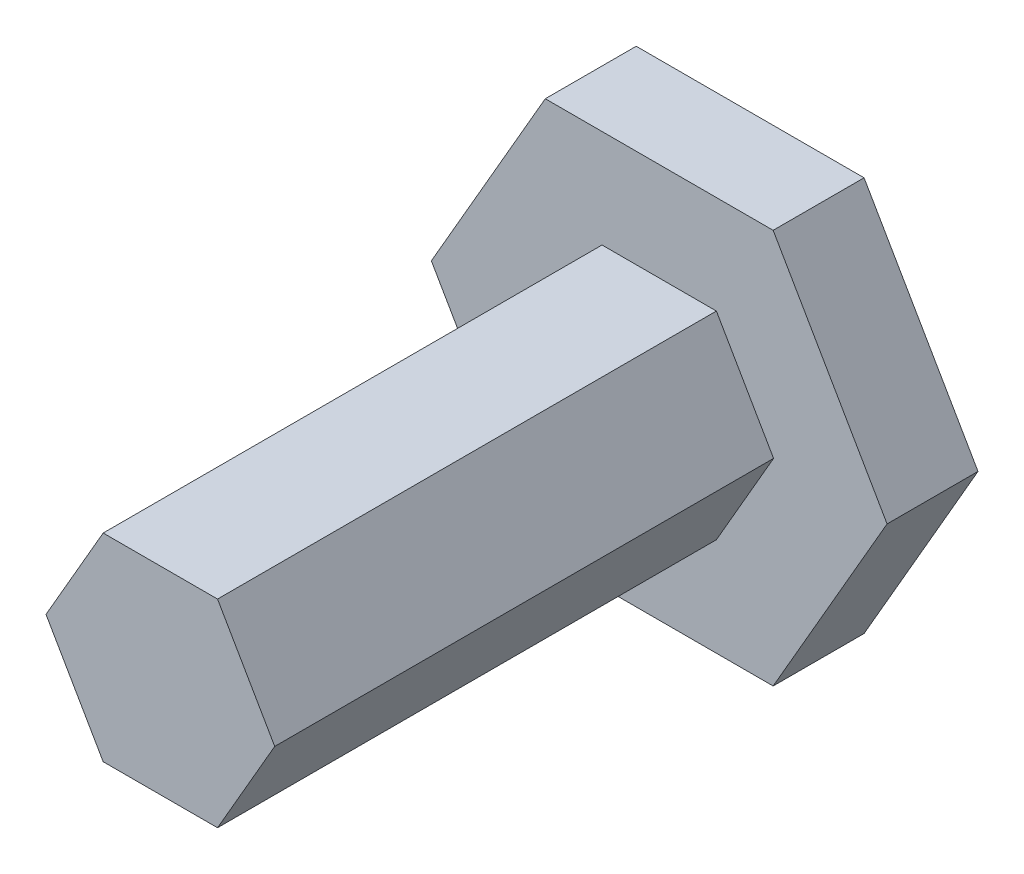
ISO-10303-21;
HEADER;
FILE_DESCRIPTION(('STEP AP214'),'2;1');
FILE_NAME('part.step','',(''),(''),'','','');
FILE_SCHEMA(('AUTOMOTIVE_DESIGN { 1 0 10303 214 1 1 1 1 }'));
ENDSEC;
DATA;
#1=APPLICATION_CONTEXT('core data for automotive mechanical design processes');
#2=APPLICATION_PROTOCOL_DEFINITION('international standard','automotive_design',2000,#1);
#3=PRODUCT_CONTEXT('',#1,'mechanical');
#4=PRODUCT('Part','Part','',(#3));
#5=PRODUCT_RELATED_PRODUCT_CATEGORY('part','',(#4));
#6=PRODUCT_DEFINITION_FORMATION('','',#4);
#7=PRODUCT_DEFINITION_CONTEXT('part definition',#1,'design');
#8=PRODUCT_DEFINITION('design','',#6,#7);
#9=PRODUCT_DEFINITION_SHAPE('','',#8);
#10=(LENGTH_UNIT() NAMED_UNIT(*) SI_UNIT(.MILLI.,.METRE.));
#11=(NAMED_UNIT(*) PLANE_ANGLE_UNIT() SI_UNIT($,.RADIAN.));
#12=(NAMED_UNIT(*) SI_UNIT($,.STERADIAN.) SOLID_ANGLE_UNIT());
#13=UNCERTAINTY_MEASURE_WITH_UNIT(LENGTH_MEASURE(1.E-05),#10,'distance_accuracy_value','');
#14=(GEOMETRIC_REPRESENTATION_CONTEXT(3) GLOBAL_UNCERTAINTY_ASSIGNED_CONTEXT((#13)) GLOBAL_UNIT_ASSIGNED_CONTEXT((#10,
#11,#12)) REPRESENTATION_CONTEXT('',''));
#15=CARTESIAN_POINT('',(0.,0.,0.));
#16=DIRECTION('',(0.,0.,1.));
#17=DIRECTION('',(1.,0.,0.));
#18=AXIS2_PLACEMENT_3D('',#15,#16,#17);
#19=CARTESIAN_POINT('',(-1.74509618943233,-1.00753175473055,10.));
#20=DIRECTION('',(0.866025403784439,0.5,0.));
#21=DIRECTION('',(-0.5,0.866025403784439,0.));
#22=AXIS2_PLACEMENT_3D('',#19,#20,#21);
#23=PLANE('',#22);
#24=DIRECTION('',(0.5,-0.866025403784439,0.));
#25=VECTOR('',#24,1.);
#26=CARTESIAN_POINT('',(-1.74509618943233,-1.00753175473055,-0.150000000000001));
#27=LINE('',#26,#25);
#28=CARTESIAN_POINT('',(-2.32679491924311,0.,-0.15));
#29=VERTEX_POINT('',#28);
#30=CARTESIAN_POINT('',(-1.16339745962156,-2.0150635094611,-0.15));
#31=VERTEX_POINT('',#30);
#32=EDGE_CURVE('E136',#29,#31,#27,.T.);
#33=ORIENTED_EDGE('',*,*,#32,.T.);
#34=DIRECTION('',(0.,0.,-1.));
#35=VECTOR('',#34,1.);
#36=CARTESIAN_POINT('',(-1.16339745962156,-2.0150635094611,10.));
#37=LINE('',#36,#35);
#38=CARTESIAN_POINT('',(-1.16339745962156,-2.0150635094611,10.));
#39=VERTEX_POINT('',#38);
#40=EDGE_CURVE('E12',#39,#31,#37,.T.);
#41=ORIENTED_EDGE('',*,*,#40,.F.);
#42=DIRECTION('',(0.5,-0.866025403784439,0.));
#43=VECTOR('',#42,1.);
#44=CARTESIAN_POINT('',(-1.74509618943233,-1.00753175473055,10.));
#45=LINE('',#44,#43);
#46=CARTESIAN_POINT('',(-2.32679491924311,0.,10.));
#47=VERTEX_POINT('',#46);
#48=EDGE_CURVE('E155',#47,#39,#45,.T.);
#49=ORIENTED_EDGE('',*,*,#48,.F.);
#50=DIRECTION('',(0.,0.,-1.));
#51=VECTOR('',#50,1.);
#52=CARTESIAN_POINT('',(-2.32679491924311,0.,10.));
#53=LINE('',#52,#51);
#54=EDGE_CURVE('E151',#47,#29,#53,.T.);
#55=ORIENTED_EDGE('',*,*,#54,.T.);
#56=EDGE_LOOP('',(#33,#41,#49,#55));
#57=FACE_BOUND('',#56,.T.);
#58=ADVANCED_FACE('F42',(#57),#23,.F.);
#59=CARTESIAN_POINT('',(0.,-2.0150635094611,10.));
#60=DIRECTION('',(0.,1.,0.));
#61=DIRECTION('',(-1.,0.,0.));
#62=AXIS2_PLACEMENT_3D('',#59,#60,#61);
#63=PLANE('',#62);
#64=DIRECTION('',(1.,0.,0.));
#65=VECTOR('',#64,1.);
#66=CARTESIAN_POINT('',(0.,-2.0150635094611,-0.150000000000001));
#67=LINE('',#66,#65);
#68=CARTESIAN_POINT('',(1.16339745962155,-2.0150635094611,-0.15));
#69=VERTEX_POINT('',#68);
#70=EDGE_CURVE('E142',#31,#69,#67,.T.);
#71=ORIENTED_EDGE('',*,*,#70,.T.);
#72=DIRECTION('',(0.,0.,-1.));
#73=VECTOR('',#72,1.);
#74=CARTESIAN_POINT('',(1.16339745962155,-2.0150635094611,10.));
#75=LINE('',#74,#73);
#76=CARTESIAN_POINT('',(1.16339745962155,-2.0150635094611,10.));
#77=VERTEX_POINT('',#76);
#78=EDGE_CURVE('E52',#77,#69,#75,.T.);
#79=ORIENTED_EDGE('',*,*,#78,.F.);
#80=DIRECTION('',(1.,0.,0.));
#81=VECTOR('',#80,1.);
#82=CARTESIAN_POINT('',(0.,-2.0150635094611,10.));
#83=LINE('',#82,#81);
#84=EDGE_CURVE('E73',#39,#77,#83,.T.);
#85=ORIENTED_EDGE('',*,*,#84,.F.);
#86=ORIENTED_EDGE('',*,*,#40,.T.);
#87=EDGE_LOOP('',(#71,#79,#85,#86));
#88=FACE_BOUND('',#87,.T.);
#89=ADVANCED_FACE('F192',(#88),#63,.F.);
#90=CARTESIAN_POINT('',(1.74509618943233,-1.00753175473055,10.));
#91=DIRECTION('',(-0.866025403784439,0.5,0.));
#92=DIRECTION('',(-0.5,-0.866025403784439,0.));
#93=AXIS2_PLACEMENT_3D('',#90,#91,#92);
#94=PLANE('',#93);
#95=DIRECTION('',(0.5,0.866025403784439,0.));
#96=VECTOR('',#95,1.);
#97=CARTESIAN_POINT('',(1.74509618943233,-1.00753175473055,-0.150000000000001));
#98=LINE('',#97,#96);
#99=CARTESIAN_POINT('',(2.32679491924311,0.,-0.15));
#100=VERTEX_POINT('',#99);
#101=EDGE_CURVE('E196',#69,#100,#98,.T.);
#102=ORIENTED_EDGE('',*,*,#101,.T.);
#103=DIRECTION('',(0.,0.,-1.));
#104=VECTOR('',#103,1.);
#105=CARTESIAN_POINT('',(2.32679491924311,0.,10.));
#106=LINE('',#105,#104);
#107=CARTESIAN_POINT('',(2.32679491924311,0.,10.));
#108=VERTEX_POINT('',#107);
#109=EDGE_CURVE('E167',#108,#100,#106,.T.);
#110=ORIENTED_EDGE('',*,*,#109,.F.);
#111=DIRECTION('',(0.5,0.866025403784439,0.));
#112=VECTOR('',#111,1.);
#113=CARTESIAN_POINT('',(1.74509618943233,-1.00753175473055,10.));
#114=LINE('',#113,#112);
#115=EDGE_CURVE('E46',#77,#108,#114,.T.);
#116=ORIENTED_EDGE('',*,*,#115,.F.);
#117=ORIENTED_EDGE('',*,*,#78,.T.);
#118=EDGE_LOOP('',(#102,#110,#116,#117));
#119=FACE_BOUND('',#118,.T.);
#120=ADVANCED_FACE('F44',(#119),#94,.F.);
#121=CARTESIAN_POINT('',(1.74509618943233,1.00753175473055,10.));
#122=DIRECTION('',(-0.866025403784439,-0.5,0.));
#123=DIRECTION('',(0.5,-0.866025403784439,0.));
#124=AXIS2_PLACEMENT_3D('',#121,#122,#123);
#125=PLANE('',#124);
#126=DIRECTION('',(-0.5,0.866025403784439,0.));
#127=VECTOR('',#126,1.);
#128=CARTESIAN_POINT('',(1.74509618943233,1.00753175473055,-0.150000000000001));
#129=LINE('',#128,#127);
#130=CARTESIAN_POINT('',(1.16339745962155,2.0150635094611,-0.15));
#131=VERTEX_POINT('',#130);
#132=EDGE_CURVE('E202',#100,#131,#129,.T.);
#133=ORIENTED_EDGE('',*,*,#132,.T.);
#134=DIRECTION('',(0.,0.,-1.));
#135=VECTOR('',#134,1.);
#136=CARTESIAN_POINT('',(1.16339745962155,2.0150635094611,10.));
#137=LINE('',#136,#135);
#138=CARTESIAN_POINT('',(1.16339745962155,2.0150635094611,10.));
#139=VERTEX_POINT('',#138);
#140=EDGE_CURVE('E159',#139,#131,#137,.T.);
#141=ORIENTED_EDGE('',*,*,#140,.F.);
#142=DIRECTION('',(-0.5,0.866025403784439,0.));
#143=VECTOR('',#142,1.);
#144=CARTESIAN_POINT('',(1.74509618943233,1.00753175473055,10.));
#145=LINE('',#144,#143);
#146=EDGE_CURVE('E79',#108,#139,#145,.T.);
#147=ORIENTED_EDGE('',*,*,#146,.F.);
#148=ORIENTED_EDGE('',*,*,#109,.T.);
#149=EDGE_LOOP('',(#133,#141,#147,#148));
#150=FACE_BOUND('',#149,.T.);
#151=ADVANCED_FACE('F199',(#150),#125,.F.);
#152=CARTESIAN_POINT('',(0.,2.0150635094611,10.));
#153=DIRECTION('',(0.,-1.,0.));
#154=DIRECTION('',(0.,0.,-1.));
#155=AXIS2_PLACEMENT_3D('',#152,#153,#154);
#156=PLANE('',#155);
#157=DIRECTION('',(-1.,0.,0.));
#158=VECTOR('',#157,1.);
#159=CARTESIAN_POINT('',(0.,2.0150635094611,-0.150000000000001));
#160=LINE('',#159,#158);
#161=CARTESIAN_POINT('',(-1.16339745962156,2.0150635094611,-0.15));
#162=VERTEX_POINT('',#161);
#163=EDGE_CURVE('E156',#131,#162,#160,.T.);
#164=ORIENTED_EDGE('',*,*,#163,.T.);
#165=DIRECTION('',(0.,0.,-1.));
#166=VECTOR('',#165,1.);
#167=CARTESIAN_POINT('',(-1.16339745962156,2.0150635094611,10.));
#168=LINE('',#167,#166);
#169=CARTESIAN_POINT('',(-1.16339745962156,2.0150635094611,10.));
#170=VERTEX_POINT('',#169);
#171=EDGE_CURVE('E154',#170,#162,#168,.T.);
#172=ORIENTED_EDGE('',*,*,#171,.F.);
#173=DIRECTION('',(-1.,0.,0.));
#174=VECTOR('',#173,1.);
#175=CARTESIAN_POINT('',(0.,2.0150635094611,10.));
#176=LINE('',#175,#174);
#177=EDGE_CURVE('E161',#139,#170,#176,.T.);
#178=ORIENTED_EDGE('',*,*,#177,.F.);
#179=ORIENTED_EDGE('',*,*,#140,.T.);
#180=EDGE_LOOP('',(#164,#172,#178,#179));
#181=FACE_BOUND('',#180,.T.);
#182=ADVANCED_FACE('F205',(#181),#156,.F.);
#183=CARTESIAN_POINT('',(-1.74509618943233,1.00753175473055,10.));
#184=DIRECTION('',(0.866025403784439,-0.5,0.));
#185=DIRECTION('',(0.5,0.866025403784439,0.));
#186=AXIS2_PLACEMENT_3D('',#183,#184,#185);
#187=PLANE('',#186);
#188=DIRECTION('',(-0.5,-0.866025403784439,0.));
#189=VECTOR('',#188,1.);
#190=CARTESIAN_POINT('',(-1.74509618943233,1.00753175473055,-0.150000000000001));
#191=LINE('',#190,#189);
#192=EDGE_CURVE('E139',#162,#29,#191,.T.);
#193=ORIENTED_EDGE('',*,*,#192,.T.);
#194=ORIENTED_EDGE('',*,*,#54,.F.);
#195=DIRECTION('',(-0.5,-0.866025403784439,0.));
#196=VECTOR('',#195,1.);
#197=CARTESIAN_POINT('',(-1.74509618943233,1.00753175473055,10.));
#198=LINE('',#197,#196);
#199=EDGE_CURVE('E61',#170,#47,#198,.T.);
#200=ORIENTED_EDGE('',*,*,#199,.F.);
#201=ORIENTED_EDGE('',*,*,#171,.T.);
#202=EDGE_LOOP('',(#193,#194,#200,#201));
#203=FACE_BOUND('',#202,.T.);
#204=ADVANCED_FACE('F150',(#203),#187,.F.);
#205=CARTESIAN_POINT('',(0.,0.,10.));
#206=DIRECTION('',(0.,0.,1.));
#207=DIRECTION('',(1.,0.,0.));
#208=AXIS2_PLACEMENT_3D('',#205,#206,#207);
#209=PLANE('',#208);
#210=ORIENTED_EDGE('',*,*,#48,.T.);
#211=ORIENTED_EDGE('',*,*,#84,.T.);
#212=ORIENTED_EDGE('',*,*,#115,.T.);
#213=ORIENTED_EDGE('',*,*,#146,.T.);
#214=ORIENTED_EDGE('',*,*,#177,.T.);
#215=ORIENTED_EDGE('',*,*,#199,.T.);
#216=EDGE_LOOP('',(#210,#211,#212,#213,#214,#215));
#217=FACE_BOUND('',#216,.T.);
#218=ADVANCED_FACE('F190',(#217),#209,.T.);
#219=CARTESIAN_POINT('',(0.,0.,-0.15));
#220=DIRECTION('',(0.,0.,1.));
#221=DIRECTION('',(1.,0.,0.));
#222=AXIS2_PLACEMENT_3D('',#219,#220,#221);
#223=PLANE('',#222);
#224=DIRECTION('',(0.5,-0.866025403784439,0.));
#225=VECTOR('',#224,1.);
#226=CARTESIAN_POINT('',(-3.47714699700121,-2.00753175473055,-0.15));
#227=LINE('',#226,#225);
#228=CARTESIAN_POINT('',(-4.63619599600161,0.,-0.15));
#229=VERTEX_POINT('',#228);
#230=CARTESIAN_POINT('',(-2.31809799800081,-4.0150635094611,-0.15));
#231=VERTEX_POINT('',#230);
#232=EDGE_CURVE('E229',#229,#231,#227,.T.);
#233=ORIENTED_EDGE('',*,*,#232,.T.);
#234=DIRECTION('',(1.,0.,0.));
#235=VECTOR('',#234,1.);
#236=CARTESIAN_POINT('',(0.,-4.0150635094611,-0.15));
#237=LINE('',#236,#235);
#238=CARTESIAN_POINT('',(2.31809799800081,-4.0150635094611,-0.15));
#239=VERTEX_POINT('',#238);
#240=EDGE_CURVE('E234',#231,#239,#237,.T.);
#241=ORIENTED_EDGE('',*,*,#240,.T.);
#242=DIRECTION('',(0.5,0.866025403784439,0.));
#243=VECTOR('',#242,1.);
#244=CARTESIAN_POINT('',(3.47714699700121,-2.00753175473055,-0.15));
#245=LINE('',#244,#243);
#246=CARTESIAN_POINT('',(4.63619599600161,0.,-0.15));
#247=VERTEX_POINT('',#246);
#248=EDGE_CURVE('E245',#239,#247,#245,.T.);
#249=ORIENTED_EDGE('',*,*,#248,.T.);
#250=DIRECTION('',(-0.5,0.866025403784439,0.));
#251=VECTOR('',#250,1.);
#252=CARTESIAN_POINT('',(3.47714699700121,2.00753175473055,-0.15));
#253=LINE('',#252,#251);
#254=CARTESIAN_POINT('',(2.3180979980008,4.0150635094611,-0.15));
#255=VERTEX_POINT('',#254);
#256=EDGE_CURVE('E241',#247,#255,#253,.T.);
#257=ORIENTED_EDGE('',*,*,#256,.T.);
#258=DIRECTION('',(-1.,0.,0.));
#259=VECTOR('',#258,1.);
#260=CARTESIAN_POINT('',(0.,4.0150635094611,-0.15));
#261=LINE('',#260,#259);
#262=CARTESIAN_POINT('',(-2.31809799800081,4.0150635094611,-0.15));
#263=VERTEX_POINT('',#262);
#264=EDGE_CURVE('E239',#255,#263,#261,.T.);
#265=ORIENTED_EDGE('',*,*,#264,.T.);
#266=DIRECTION('',(-0.5,-0.866025403784439,0.));
#267=VECTOR('',#266,1.);
#268=CARTESIAN_POINT('',(-3.47714699700121,2.00753175473055,-0.15));
#269=LINE('',#268,#267);
#270=EDGE_CURVE('E184',#263,#229,#269,.T.);
#271=ORIENTED_EDGE('',*,*,#270,.T.);
#272=EDGE_LOOP('',(#233,#241,#249,#257,#265,#271));
#273=FACE_BOUND('',#272,.T.);
#274=ORIENTED_EDGE('',*,*,#32,.F.);
#275=ORIENTED_EDGE('',*,*,#192,.F.);
#276=ORIENTED_EDGE('',*,*,#163,.F.);
#277=ORIENTED_EDGE('',*,*,#132,.F.);
#278=ORIENTED_EDGE('',*,*,#101,.F.);
#279=ORIENTED_EDGE('',*,*,#70,.F.);
#280=EDGE_LOOP('',(#274,#275,#276,#277,#278,#279));
#281=FACE_BOUND('',#280,.T.);
#282=ADVANCED_FACE('F138',(#273,#281),#223,.T.);
#283=CARTESIAN_POINT('',(-3.47714699700121,-2.00753175473055,-2.));
#284=DIRECTION('',(-0.866025403784439,-0.5,0.));
#285=DIRECTION('',(0.5,-0.866025403784439,0.));
#286=AXIS2_PLACEMENT_3D('',#283,#284,#285);
#287=PLANE('',#286);
#288=ORIENTED_EDGE('',*,*,#232,.F.);
#289=DIRECTION('',(0.,0.,1.));
#290=VECTOR('',#289,1.);
#291=CARTESIAN_POINT('',(-4.63619599600161,0.,-2.));
#292=LINE('',#291,#290);
#293=CARTESIAN_POINT('',(-4.63619599600161,0.,-2.));
#294=VERTEX_POINT('',#293);
#295=EDGE_CURVE('E146',#294,#229,#292,.T.);
#296=ORIENTED_EDGE('',*,*,#295,.F.);
#297=DIRECTION('',(0.5,-0.866025403784439,0.));
#298=VECTOR('',#297,1.);
#299=CARTESIAN_POINT('',(-3.47714699700121,-2.00753175473055,-2.));
#300=LINE('',#299,#298);
#301=CARTESIAN_POINT('',(-2.31809799800081,-4.0150635094611,-2.));
#302=VERTEX_POINT('',#301);
#303=EDGE_CURVE('E181',#294,#302,#300,.T.);
#304=ORIENTED_EDGE('',*,*,#303,.T.);
#305=DIRECTION('',(0.,0.,1.));
#306=VECTOR('',#305,1.);
#307=CARTESIAN_POINT('',(-2.31809799800081,-4.0150635094611,-2.));
#308=LINE('',#307,#306);
#309=EDGE_CURVE('E187',#302,#231,#308,.T.);
#310=ORIENTED_EDGE('',*,*,#309,.T.);
#311=EDGE_LOOP('',(#288,#296,#304,#310));
#312=FACE_BOUND('',#311,.T.);
#313=ADVANCED_FACE('F230',(#312),#287,.T.);
#314=CARTESIAN_POINT('',(-3.47714699700121,2.00753175473055,-2.));
#315=DIRECTION('',(-0.866025403784439,0.5,0.));
#316=DIRECTION('',(-0.5,-0.866025403784439,0.));
#317=AXIS2_PLACEMENT_3D('',#314,#315,#316);
#318=PLANE('',#317);
#319=ORIENTED_EDGE('',*,*,#270,.F.);
#320=DIRECTION('',(0.,0.,1.));
#321=VECTOR('',#320,1.);
#322=CARTESIAN_POINT('',(-2.31809799800081,4.0150635094611,-2.));
#323=LINE('',#322,#321);
#324=CARTESIAN_POINT('',(-2.31809799800081,4.0150635094611,-2.));
#325=VERTEX_POINT('',#324);
#326=EDGE_CURVE('E213',#325,#263,#323,.T.);
#327=ORIENTED_EDGE('',*,*,#326,.F.);
#328=DIRECTION('',(-0.5,-0.866025403784439,0.));
#329=VECTOR('',#328,1.);
#330=CARTESIAN_POINT('',(-3.47714699700121,2.00753175473055,-2.));
#331=LINE('',#330,#329);
#332=EDGE_CURVE('E171',#325,#294,#331,.T.);
#333=ORIENTED_EDGE('',*,*,#332,.T.);
#334=ORIENTED_EDGE('',*,*,#295,.T.);
#335=EDGE_LOOP('',(#319,#327,#333,#334));
#336=FACE_BOUND('',#335,.T.);
#337=ADVANCED_FACE('F223',(#336),#318,.T.);
#338=CARTESIAN_POINT('',(0.,4.0150635094611,-2.));
#339=DIRECTION('',(0.,1.,0.));
#340=DIRECTION('',(0.,0.,1.));
#341=AXIS2_PLACEMENT_3D('',#338,#339,#340);
#342=PLANE('',#341);
#343=ORIENTED_EDGE('',*,*,#264,.F.);
#344=DIRECTION('',(0.,0.,1.));
#345=VECTOR('',#344,1.);
#346=CARTESIAN_POINT('',(2.3180979980008,4.0150635094611,-2.));
#347=LINE('',#346,#345);
#348=CARTESIAN_POINT('',(2.3180979980008,4.0150635094611,-2.));
#349=VERTEX_POINT('',#348);
#350=EDGE_CURVE('E211',#349,#255,#347,.T.);
#351=ORIENTED_EDGE('',*,*,#350,.F.);
#352=DIRECTION('',(-1.,0.,0.));
#353=VECTOR('',#352,1.);
#354=CARTESIAN_POINT('',(0.,4.0150635094611,-2.));
#355=LINE('',#354,#353);
#356=EDGE_CURVE('E168',#349,#325,#355,.T.);
#357=ORIENTED_EDGE('',*,*,#356,.T.);
#358=ORIENTED_EDGE('',*,*,#326,.T.);
#359=EDGE_LOOP('',(#343,#351,#357,#358));
#360=FACE_BOUND('',#359,.T.);
#361=ADVANCED_FACE('F261',(#360),#342,.T.);
#362=CARTESIAN_POINT('',(3.47714699700121,2.00753175473055,-2.));
#363=DIRECTION('',(0.866025403784439,0.5,0.));
#364=DIRECTION('',(-0.5,0.866025403784439,0.));
#365=AXIS2_PLACEMENT_3D('',#362,#363,#364);
#366=PLANE('',#365);
#367=ORIENTED_EDGE('',*,*,#256,.F.);
#368=DIRECTION('',(0.,0.,1.));
#369=VECTOR('',#368,1.);
#370=CARTESIAN_POINT('',(4.63619599600161,0.,-2.));
#371=LINE('',#370,#369);
#372=CARTESIAN_POINT('',(4.63619599600161,0.,-2.));
#373=VERTEX_POINT('',#372);
#374=EDGE_CURVE('E214',#373,#247,#371,.T.);
#375=ORIENTED_EDGE('',*,*,#374,.F.);
#376=DIRECTION('',(-0.5,0.866025403784439,0.));
#377=VECTOR('',#376,1.);
#378=CARTESIAN_POINT('',(3.47714699700121,2.00753175473055,-2.));
#379=LINE('',#378,#377);
#380=EDGE_CURVE('E172',#373,#349,#379,.T.);
#381=ORIENTED_EDGE('',*,*,#380,.T.);
#382=ORIENTED_EDGE('',*,*,#350,.T.);
#383=EDGE_LOOP('',(#367,#375,#381,#382));
#384=FACE_BOUND('',#383,.T.);
#385=ADVANCED_FACE('F258',(#384),#366,.T.);
#386=CARTESIAN_POINT('',(3.47714699700121,-2.00753175473055,-2.));
#387=DIRECTION('',(0.866025403784439,-0.5,0.));
#388=DIRECTION('',(0.5,0.866025403784439,0.));
#389=AXIS2_PLACEMENT_3D('',#386,#387,#388);
#390=PLANE('',#389);
#391=ORIENTED_EDGE('',*,*,#248,.F.);
#392=DIRECTION('',(0.,0.,1.));
#393=VECTOR('',#392,1.);
#394=CARTESIAN_POINT('',(2.31809799800081,-4.0150635094611,-2.));
#395=LINE('',#394,#393);
#396=CARTESIAN_POINT('',(2.31809799800081,-4.0150635094611,-2.));
#397=VERTEX_POINT('',#396);
#398=EDGE_CURVE('E217',#397,#239,#395,.T.);
#399=ORIENTED_EDGE('',*,*,#398,.F.);
#400=DIRECTION('',(0.5,0.866025403784439,0.));
#401=VECTOR('',#400,1.);
#402=CARTESIAN_POINT('',(3.47714699700121,-2.00753175473055,-2.));
#403=LINE('',#402,#401);
#404=EDGE_CURVE('E175',#397,#373,#403,.T.);
#405=ORIENTED_EDGE('',*,*,#404,.T.);
#406=ORIENTED_EDGE('',*,*,#374,.T.);
#407=EDGE_LOOP('',(#391,#399,#405,#406));
#408=FACE_BOUND('',#407,.T.);
#409=ADVANCED_FACE('F254',(#408),#390,.T.);
#410=CARTESIAN_POINT('',(0.,-4.0150635094611,-2.));
#411=DIRECTION('',(0.,-1.,0.));
#412=DIRECTION('',(1.,0.,0.));
#413=AXIS2_PLACEMENT_3D('',#410,#411,#412);
#414=PLANE('',#413);
#415=ORIENTED_EDGE('',*,*,#240,.F.);
#416=ORIENTED_EDGE('',*,*,#309,.F.);
#417=DIRECTION('',(1.,0.,0.));
#418=VECTOR('',#417,1.);
#419=CARTESIAN_POINT('',(0.,-4.0150635094611,-2.));
#420=LINE('',#419,#418);
#421=EDGE_CURVE('E178',#302,#397,#420,.T.);
#422=ORIENTED_EDGE('',*,*,#421,.T.);
#423=ORIENTED_EDGE('',*,*,#398,.T.);
#424=EDGE_LOOP('',(#415,#416,#422,#423));
#425=FACE_BOUND('',#424,.T.);
#426=ADVANCED_FACE('F250',(#425),#414,.T.);
#427=CARTESIAN_POINT('',(0.,0.,-2.));
#428=DIRECTION('',(0.,0.,1.));
#429=DIRECTION('',(1.,0.,0.));
#430=AXIS2_PLACEMENT_3D('',#427,#428,#429);
#431=PLANE('',#430);
#432=ORIENTED_EDGE('',*,*,#303,.F.);
#433=ORIENTED_EDGE('',*,*,#332,.F.);
#434=ORIENTED_EDGE('',*,*,#356,.F.);
#435=ORIENTED_EDGE('',*,*,#380,.F.);
#436=ORIENTED_EDGE('',*,*,#404,.F.);
#437=ORIENTED_EDGE('',*,*,#421,.F.);
#438=EDGE_LOOP('',(#432,#433,#434,#435,#436,#437));
#439=FACE_BOUND('',#438,.T.);
#440=ADVANCED_FACE('F263',(#439),#431,.F.);
#441=CLOSED_SHELL('',(#58,#89,#120,#151,#182,#204,#218,#282,#313,#337,#361,#385,#409,#426,#440));
#442=MANIFOLD_SOLID_BREP('B2',#441);
#443=ADVANCED_BREP_SHAPE_REPRESENTATION('',(#18,#442),#14);
#444=SHAPE_DEFINITION_REPRESENTATION(#9,#443);
ENDSEC;
END-ISO-10303-21;
